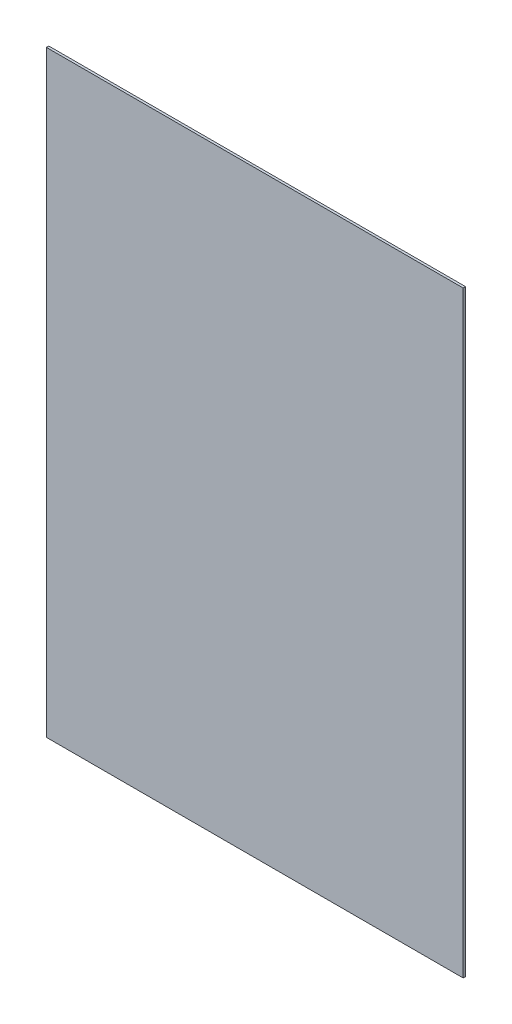
ISO-10303-21;
HEADER;
FILE_DESCRIPTION(('STEP AP214'),'2;1');
FILE_NAME('part.step','',(''),(''),'','','');
FILE_SCHEMA(('AUTOMOTIVE_DESIGN { 1 0 10303 214 1 1 1 1 }'));
ENDSEC;
DATA;
#1=APPLICATION_CONTEXT('core data for automotive mechanical design processes');
#2=APPLICATION_PROTOCOL_DEFINITION('international standard','automotive_design',2000,#1);
#3=PRODUCT_CONTEXT('',#1,'mechanical');
#4=PRODUCT('Part','Part','',(#3));
#5=PRODUCT_RELATED_PRODUCT_CATEGORY('part','',(#4));
#6=PRODUCT_DEFINITION_FORMATION('','',#4);
#7=PRODUCT_DEFINITION_CONTEXT('part definition',#1,'design');
#8=PRODUCT_DEFINITION('design','',#6,#7);
#9=PRODUCT_DEFINITION_SHAPE('','',#8);
#10=(LENGTH_UNIT() NAMED_UNIT(*) SI_UNIT(.MILLI.,.METRE.));
#11=(NAMED_UNIT(*) PLANE_ANGLE_UNIT() SI_UNIT($,.RADIAN.));
#12=(NAMED_UNIT(*) SI_UNIT($,.STERADIAN.) SOLID_ANGLE_UNIT());
#13=UNCERTAINTY_MEASURE_WITH_UNIT(LENGTH_MEASURE(1.E-05),#10,'distance_accuracy_value','');
#14=(GEOMETRIC_REPRESENTATION_CONTEXT(3) GLOBAL_UNCERTAINTY_ASSIGNED_CONTEXT((#13)) GLOBAL_UNIT_ASSIGNED_CONTEXT((#10,
#11,#12)) REPRESENTATION_CONTEXT('',''));
#15=CARTESIAN_POINT('',(0.,0.,0.));
#16=DIRECTION('',(0.,0.,1.));
#17=DIRECTION('',(1.,0.,0.));
#18=AXIS2_PLACEMENT_3D('',#15,#16,#17);
#19=CARTESIAN_POINT('',(0.,0.,0.8));
#20=DIRECTION('',(1.,0.,0.));
#21=DIRECTION('',(0.,0.,-1.));
#22=AXIS2_PLACEMENT_3D('',#19,#20,#21);
#23=PLANE('',#22);
#24=DIRECTION('',(0.,-1.,0.));
#25=VECTOR('',#24,1.);
#26=CARTESIAN_POINT('',(0.,0.,0.));
#27=LINE('',#26,#25);
#28=CARTESIAN_POINT('',(0.,200.,0.));
#29=VERTEX_POINT('',#28);
#30=CARTESIAN_POINT('',(0.,0.,0.));
#31=VERTEX_POINT('',#30);
#32=EDGE_CURVE('E96',#29,#31,#27,.T.);
#33=ORIENTED_EDGE('',*,*,#32,.T.);
#34=DIRECTION('',(0.,0.,-1.));
#35=VECTOR('',#34,1.);
#36=CARTESIAN_POINT('',(0.,0.,0.8));
#37=LINE('',#36,#35);
#38=CARTESIAN_POINT('',(0.,0.,0.8));
#39=VERTEX_POINT('',#38);
#40=EDGE_CURVE('E11',#39,#31,#37,.T.);
#41=ORIENTED_EDGE('',*,*,#40,.F.);
#42=DIRECTION('',(0.,-1.,0.));
#43=VECTOR('',#42,1.);
#44=CARTESIAN_POINT('',(0.,0.,0.8));
#45=LINE('',#44,#43);
#46=CARTESIAN_POINT('',(0.,200.,0.8));
#47=VERTEX_POINT('',#46);
#48=EDGE_CURVE('E84',#47,#39,#45,.T.);
#49=ORIENTED_EDGE('',*,*,#48,.F.);
#50=DIRECTION('',(0.,0.,-1.));
#51=VECTOR('',#50,1.);
#52=CARTESIAN_POINT('',(0.,200.,0.8));
#53=LINE('',#52,#51);
#54=EDGE_CURVE('E92',#47,#29,#53,.T.);
#55=ORIENTED_EDGE('',*,*,#54,.T.);
#56=EDGE_LOOP('',(#33,#41,#49,#55));
#57=FACE_BOUND('',#56,.T.);
#58=ADVANCED_FACE('F33',(#57),#23,.F.);
#59=CARTESIAN_POINT('',(0.,0.,0.8));
#60=DIRECTION('',(0.,1.,0.));
#61=DIRECTION('',(0.,0.,1.));
#62=AXIS2_PLACEMENT_3D('',#59,#60,#61);
#63=PLANE('',#62);
#64=DIRECTION('',(1.,0.,0.));
#65=VECTOR('',#64,1.);
#66=CARTESIAN_POINT('',(0.,0.,0.));
#67=LINE('',#66,#65);
#68=CARTESIAN_POINT('',(139.5,0.,0.));
#69=VERTEX_POINT('',#68);
#70=EDGE_CURVE('E88',#31,#69,#67,.T.);
#71=ORIENTED_EDGE('',*,*,#70,.T.);
#72=DIRECTION('',(0.,0.,-1.));
#73=VECTOR('',#72,1.);
#74=CARTESIAN_POINT('',(139.5,0.,0.8));
#75=LINE('',#74,#73);
#76=CARTESIAN_POINT('',(139.5,0.,0.8));
#77=VERTEX_POINT('',#76);
#78=EDGE_CURVE('E41',#77,#69,#75,.T.);
#79=ORIENTED_EDGE('',*,*,#78,.F.);
#80=DIRECTION('',(1.,0.,0.));
#81=VECTOR('',#80,1.);
#82=CARTESIAN_POINT('',(0.,0.,0.8));
#83=LINE('',#82,#81);
#84=EDGE_CURVE('E79',#39,#77,#83,.T.);
#85=ORIENTED_EDGE('',*,*,#84,.F.);
#86=ORIENTED_EDGE('',*,*,#40,.T.);
#87=EDGE_LOOP('',(#71,#79,#85,#86));
#88=FACE_BOUND('',#87,.T.);
#89=ADVANCED_FACE('F87',(#88),#63,.F.);
#90=CARTESIAN_POINT('',(139.5,0.,0.8));
#91=DIRECTION('',(-1.,0.,0.));
#92=DIRECTION('',(0.,0.,1.));
#93=AXIS2_PLACEMENT_3D('',#90,#91,#92);
#94=PLANE('',#93);
#95=DIRECTION('',(0.,1.,0.));
#96=VECTOR('',#95,1.);
#97=CARTESIAN_POINT('',(139.5,0.,0.));
#98=LINE('',#97,#96);
#99=CARTESIAN_POINT('',(139.5,200.,0.));
#100=VERTEX_POINT('',#99);
#101=EDGE_CURVE('E66',#69,#100,#98,.T.);
#102=ORIENTED_EDGE('',*,*,#101,.T.);
#103=DIRECTION('',(0.,0.,-1.));
#104=VECTOR('',#103,1.);
#105=CARTESIAN_POINT('',(139.5,200.,0.8));
#106=LINE('',#105,#104);
#107=CARTESIAN_POINT('',(139.5,200.,0.8));
#108=VERTEX_POINT('',#107);
#109=EDGE_CURVE('E89',#108,#100,#106,.T.);
#110=ORIENTED_EDGE('',*,*,#109,.F.);
#111=DIRECTION('',(0.,1.,0.));
#112=VECTOR('',#111,1.);
#113=CARTESIAN_POINT('',(139.5,0.,0.8));
#114=LINE('',#113,#112);
#115=EDGE_CURVE('E82',#77,#108,#114,.T.);
#116=ORIENTED_EDGE('',*,*,#115,.F.);
#117=ORIENTED_EDGE('',*,*,#78,.T.);
#118=EDGE_LOOP('',(#102,#110,#116,#117));
#119=FACE_BOUND('',#118,.T.);
#120=ADVANCED_FACE('F90',(#119),#94,.F.);
#121=CARTESIAN_POINT('',(0.,200.,0.8));
#122=DIRECTION('',(0.,-1.,0.));
#123=DIRECTION('',(0.,0.,-1.));
#124=AXIS2_PLACEMENT_3D('',#121,#122,#123);
#125=PLANE('',#124);
#126=DIRECTION('',(-1.,0.,0.));
#127=VECTOR('',#126,1.);
#128=CARTESIAN_POINT('',(0.,200.,0.));
#129=LINE('',#128,#127);
#130=EDGE_CURVE('E72',#100,#29,#129,.T.);
#131=ORIENTED_EDGE('',*,*,#130,.T.);
#132=ORIENTED_EDGE('',*,*,#54,.F.);
#133=DIRECTION('',(-1.,0.,0.));
#134=VECTOR('',#133,1.);
#135=CARTESIAN_POINT('',(0.,200.,0.8));
#136=LINE('',#135,#134);
#137=EDGE_CURVE('E49',#108,#47,#136,.T.);
#138=ORIENTED_EDGE('',*,*,#137,.F.);
#139=ORIENTED_EDGE('',*,*,#109,.T.);
#140=EDGE_LOOP('',(#131,#132,#138,#139));
#141=FACE_BOUND('',#140,.T.);
#142=ADVANCED_FACE('F103',(#141),#125,.F.);
#143=CARTESIAN_POINT('',(0.,0.,0.8));
#144=DIRECTION('',(0.,0.,-1.));
#145=DIRECTION('',(-1.,0.,0.));
#146=AXIS2_PLACEMENT_3D('',#143,#144,#145);
#147=PLANE('',#146);
#148=ORIENTED_EDGE('',*,*,#48,.T.);
#149=ORIENTED_EDGE('',*,*,#84,.T.);
#150=ORIENTED_EDGE('',*,*,#115,.T.);
#151=ORIENTED_EDGE('',*,*,#137,.T.);
#152=EDGE_LOOP('',(#148,#149,#150,#151));
#153=FACE_BOUND('',#152,.T.);
#154=ADVANCED_FACE('F80',(#153),#147,.F.);
#155=CARTESIAN_POINT('',(0.,0.,0.));
#156=DIRECTION('',(0.,0.,-1.));
#157=DIRECTION('',(-1.,0.,0.));
#158=AXIS2_PLACEMENT_3D('',#155,#156,#157);
#159=PLANE('',#158);
#160=ORIENTED_EDGE('',*,*,#32,.F.);
#161=ORIENTED_EDGE('',*,*,#130,.F.);
#162=ORIENTED_EDGE('',*,*,#101,.F.);
#163=ORIENTED_EDGE('',*,*,#70,.F.);
#164=EDGE_LOOP('',(#160,#161,#162,#163));
#165=FACE_BOUND('',#164,.T.);
#166=ADVANCED_FACE('F106',(#165),#159,.T.);
#167=CLOSED_SHELL('',(#58,#89,#120,#142,#154,#166));
#168=MANIFOLD_SOLID_BREP('B2',#167);
#169=ADVANCED_BREP_SHAPE_REPRESENTATION('',(#18,#168),#14);
#170=SHAPE_DEFINITION_REPRESENTATION(#9,#169);
ENDSEC;
END-ISO-10303-21;
